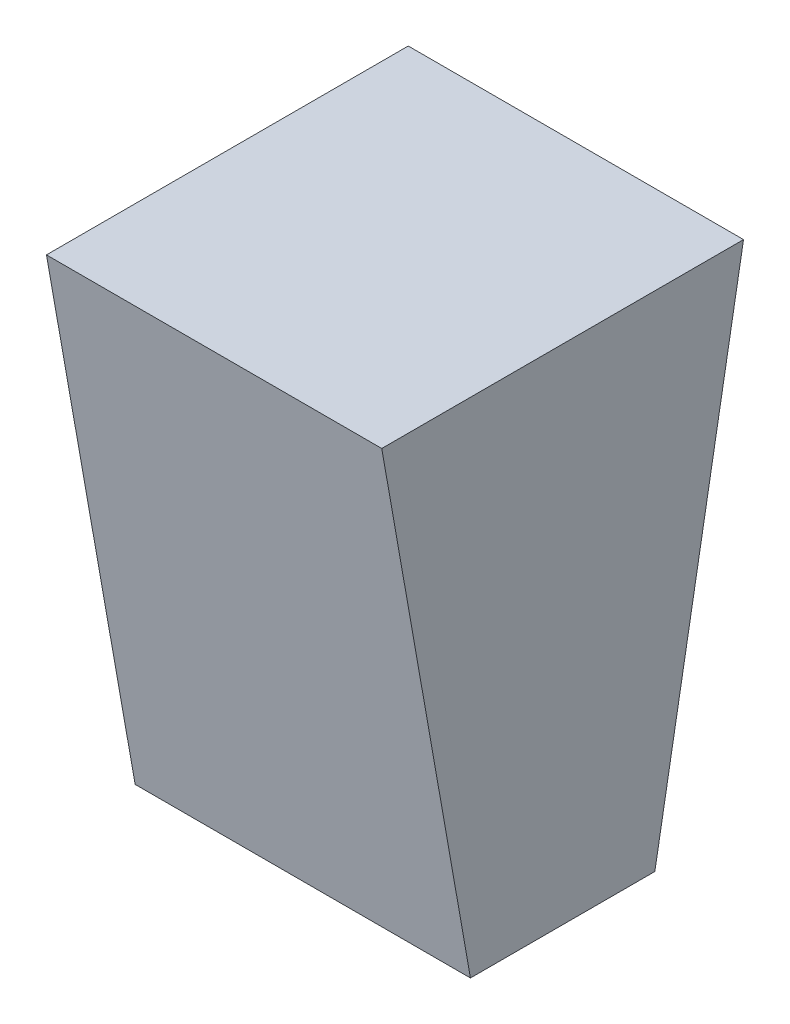
ISO-10303-21;
HEADER;
FILE_DESCRIPTION(('STEP AP214'),'2;1');
FILE_NAME('part.step','',(''),(''),'','','');
FILE_SCHEMA(('AUTOMOTIVE_DESIGN { 1 0 10303 214 1 1 1 1 }'));
ENDSEC;
DATA;
#1=APPLICATION_CONTEXT('core data for automotive mechanical design processes');
#2=APPLICATION_PROTOCOL_DEFINITION('international standard','automotive_design',2000,#1);
#3=PRODUCT_CONTEXT('',#1,'mechanical');
#4=PRODUCT('Part','Part','',(#3));
#5=PRODUCT_RELATED_PRODUCT_CATEGORY('part','',(#4));
#6=PRODUCT_DEFINITION_FORMATION('','',#4);
#7=PRODUCT_DEFINITION_CONTEXT('part definition',#1,'design');
#8=PRODUCT_DEFINITION('design','',#6,#7);
#9=PRODUCT_DEFINITION_SHAPE('','',#8);
#10=(LENGTH_UNIT() NAMED_UNIT(*) SI_UNIT(.MILLI.,.METRE.));
#11=(NAMED_UNIT(*) PLANE_ANGLE_UNIT() SI_UNIT($,.RADIAN.));
#12=(NAMED_UNIT(*) SI_UNIT($,.STERADIAN.) SOLID_ANGLE_UNIT());
#13=UNCERTAINTY_MEASURE_WITH_UNIT(LENGTH_MEASURE(1.E-05),#10,'distance_accuracy_value','');
#14=(GEOMETRIC_REPRESENTATION_CONTEXT(3) GLOBAL_UNCERTAINTY_ASSIGNED_CONTEXT((#13)) GLOBAL_UNIT_ASSIGNED_CONTEXT((#10,
#11,#12)) REPRESENTATION_CONTEXT('',''));
#15=CARTESIAN_POINT('',(0.,0.,0.));
#16=DIRECTION('',(0.,0.,1.));
#17=DIRECTION('',(1.,0.,0.));
#18=AXIS2_PLACEMENT_3D('',#15,#16,#17);
#19=CARTESIAN_POINT('',(200.,0.,0.));
#20=DIRECTION('',(0.,0.173648177666935,-0.984807753012207));
#21=DIRECTION('',(0.,0.984807753012207,0.173648177666935));
#22=AXIS2_PLACEMENT_3D('',#19,#20,#21);
#23=PLANE('',#22);
#24=DIRECTION('',(0.,-0.984807753012207,-0.173648177666935));
#25=VECTOR('',#24,1.);
#26=CARTESIAN_POINT('',(0.,0.,0.));
#27=LINE('',#26,#25);
#28=CARTESIAN_POINT('',(0.,300.,52.8980942125409));
#29=VERTEX_POINT('',#28);
#30=CARTESIAN_POINT('',(0.,0.,0.));
#31=VERTEX_POINT('',#30);
#32=EDGE_CURVE('E96',#29,#31,#27,.T.);
#33=ORIENTED_EDGE('',*,*,#32,.T.);
#34=DIRECTION('',(-1.,0.,0.));
#35=VECTOR('',#34,1.);
#36=CARTESIAN_POINT('',(200.,0.,0.));
#37=LINE('',#36,#35);
#38=CARTESIAN_POINT('',(200.,0.,0.));
#39=VERTEX_POINT('',#38);
#40=EDGE_CURVE('E11',#39,#31,#37,.T.);
#41=ORIENTED_EDGE('',*,*,#40,.F.);
#42=DIRECTION('',(0.,-0.984807753012207,-0.173648177666935));
#43=VECTOR('',#42,1.);
#44=CARTESIAN_POINT('',(200.,0.,0.));
#45=LINE('',#44,#43);
#46=CARTESIAN_POINT('',(200.,300.,52.8980942125409));
#47=VERTEX_POINT('',#46);
#48=EDGE_CURVE('E84',#47,#39,#45,.T.);
#49=ORIENTED_EDGE('',*,*,#48,.F.);
#50=DIRECTION('',(-1.,0.,0.));
#51=VECTOR('',#50,1.);
#52=CARTESIAN_POINT('',(200.,300.,52.8980942125409));
#53=LINE('',#52,#51);
#54=EDGE_CURVE('E92',#47,#29,#53,.T.);
#55=ORIENTED_EDGE('',*,*,#54,.T.);
#56=EDGE_LOOP('',(#33,#41,#49,#55));
#57=FACE_BOUND('',#56,.T.);
#58=ADVANCED_FACE('F33',(#57),#23,.F.);
#59=CARTESIAN_POINT('',(200.,0.,0.));
#60=DIRECTION('',(0.,1.,0.));
#61=DIRECTION('',(0.,0.,1.));
#62=AXIS2_PLACEMENT_3D('',#59,#60,#61);
#63=PLANE('',#62);
#64=DIRECTION('',(0.,0.,-1.));
#65=VECTOR('',#64,1.);
#66=CARTESIAN_POINT('',(0.,0.,0.));
#67=LINE('',#66,#65);
#68=CARTESIAN_POINT('',(0.,0.,-110.));
#69=VERTEX_POINT('',#68);
#70=EDGE_CURVE('E88',#31,#69,#67,.T.);
#71=ORIENTED_EDGE('',*,*,#70,.T.);
#72=DIRECTION('',(-1.,0.,0.));
#73=VECTOR('',#72,1.);
#74=CARTESIAN_POINT('',(200.,0.,-110.));
#75=LINE('',#74,#73);
#76=CARTESIAN_POINT('',(200.,0.,-110.));
#77=VERTEX_POINT('',#76);
#78=EDGE_CURVE('E41',#77,#69,#75,.T.);
#79=ORIENTED_EDGE('',*,*,#78,.F.);
#80=DIRECTION('',(0.,0.,-1.));
#81=VECTOR('',#80,1.);
#82=CARTESIAN_POINT('',(200.,0.,0.));
#83=LINE('',#82,#81);
#84=EDGE_CURVE('E79',#39,#77,#83,.T.);
#85=ORIENTED_EDGE('',*,*,#84,.F.);
#86=ORIENTED_EDGE('',*,*,#40,.T.);
#87=EDGE_LOOP('',(#71,#79,#85,#86));
#88=FACE_BOUND('',#87,.T.);
#89=ADVANCED_FACE('F87',(#88),#63,.F.);
#90=CARTESIAN_POINT('',(200.,0.,-110.));
#91=DIRECTION('',(0.,0.173648177666927,0.984807753012208));
#92=DIRECTION('',(0.,-0.984807753012209,0.173648177666927));
#93=AXIS2_PLACEMENT_3D('',#90,#91,#92);
#94=PLANE('',#93);
#95=DIRECTION('',(0.,0.984807753012208,-0.173648177666927));
#96=VECTOR('',#95,1.);
#97=CARTESIAN_POINT('',(0.,0.,-110.));
#98=LINE('',#97,#96);
#99=CARTESIAN_POINT('',(0.,300.,-162.898094212539));
#100=VERTEX_POINT('',#99);
#101=EDGE_CURVE('E66',#69,#100,#98,.T.);
#102=ORIENTED_EDGE('',*,*,#101,.T.);
#103=DIRECTION('',(-1.,0.,0.));
#104=VECTOR('',#103,1.);
#105=CARTESIAN_POINT('',(200.,300.,-162.898094212539));
#106=LINE('',#105,#104);
#107=CARTESIAN_POINT('',(200.,300.,-162.898094212539));
#108=VERTEX_POINT('',#107);
#109=EDGE_CURVE('E89',#108,#100,#106,.T.);
#110=ORIENTED_EDGE('',*,*,#109,.F.);
#111=DIRECTION('',(0.,0.984807753012208,-0.173648177666927));
#112=VECTOR('',#111,1.);
#113=CARTESIAN_POINT('',(200.,0.,-110.));
#114=LINE('',#113,#112);
#115=EDGE_CURVE('E82',#77,#108,#114,.T.);
#116=ORIENTED_EDGE('',*,*,#115,.F.);
#117=ORIENTED_EDGE('',*,*,#78,.T.);
#118=EDGE_LOOP('',(#102,#110,#116,#117));
#119=FACE_BOUND('',#118,.T.);
#120=ADVANCED_FACE('F90',(#119),#94,.F.);
#121=CARTESIAN_POINT('',(200.,300.,52.8980942125409));
#122=DIRECTION('',(0.,-1.,0.));
#123=DIRECTION('',(0.,0.,-1.));
#124=AXIS2_PLACEMENT_3D('',#121,#122,#123);
#125=PLANE('',#124);
#126=DIRECTION('',(0.,0.,1.));
#127=VECTOR('',#126,1.);
#128=CARTESIAN_POINT('',(0.,300.,52.8980942125409));
#129=LINE('',#128,#127);
#130=EDGE_CURVE('E72',#100,#29,#129,.T.);
#131=ORIENTED_EDGE('',*,*,#130,.T.);
#132=ORIENTED_EDGE('',*,*,#54,.F.);
#133=DIRECTION('',(0.,0.,1.));
#134=VECTOR('',#133,1.);
#135=CARTESIAN_POINT('',(200.,300.,52.8980942125409));
#136=LINE('',#135,#134);
#137=EDGE_CURVE('E49',#108,#47,#136,.T.);
#138=ORIENTED_EDGE('',*,*,#137,.F.);
#139=ORIENTED_EDGE('',*,*,#109,.T.);
#140=EDGE_LOOP('',(#131,#132,#138,#139));
#141=FACE_BOUND('',#140,.T.);
#142=ADVANCED_FACE('F103',(#141),#125,.F.);
#143=CARTESIAN_POINT('',(200.,0.,0.));
#144=DIRECTION('',(-1.,0.,0.));
#145=DIRECTION('',(0.,0.,1.));
#146=AXIS2_PLACEMENT_3D('',#143,#144,#145);
#147=PLANE('',#146);
#148=ORIENTED_EDGE('',*,*,#48,.T.);
#149=ORIENTED_EDGE('',*,*,#84,.T.);
#150=ORIENTED_EDGE('',*,*,#115,.T.);
#151=ORIENTED_EDGE('',*,*,#137,.T.);
#152=EDGE_LOOP('',(#148,#149,#150,#151));
#153=FACE_BOUND('',#152,.T.);
#154=ADVANCED_FACE('F80',(#153),#147,.F.);
#155=CARTESIAN_POINT('',(0.,0.,0.));
#156=DIRECTION('',(-1.,0.,0.));
#157=DIRECTION('',(0.,0.,1.));
#158=AXIS2_PLACEMENT_3D('',#155,#156,#157);
#159=PLANE('',#158);
#160=ORIENTED_EDGE('',*,*,#32,.F.);
#161=ORIENTED_EDGE('',*,*,#130,.F.);
#162=ORIENTED_EDGE('',*,*,#101,.F.);
#163=ORIENTED_EDGE('',*,*,#70,.F.);
#164=EDGE_LOOP('',(#160,#161,#162,#163));
#165=FACE_BOUND('',#164,.T.);
#166=ADVANCED_FACE('F106',(#165),#159,.T.);
#167=CLOSED_SHELL('',(#58,#89,#120,#142,#154,#166));
#168=MANIFOLD_SOLID_BREP('B2',#167);
#169=ADVANCED_BREP_SHAPE_REPRESENTATION('',(#18,#168),#14);
#170=SHAPE_DEFINITION_REPRESENTATION(#9,#169);
ENDSEC;
END-ISO-10303-21;
